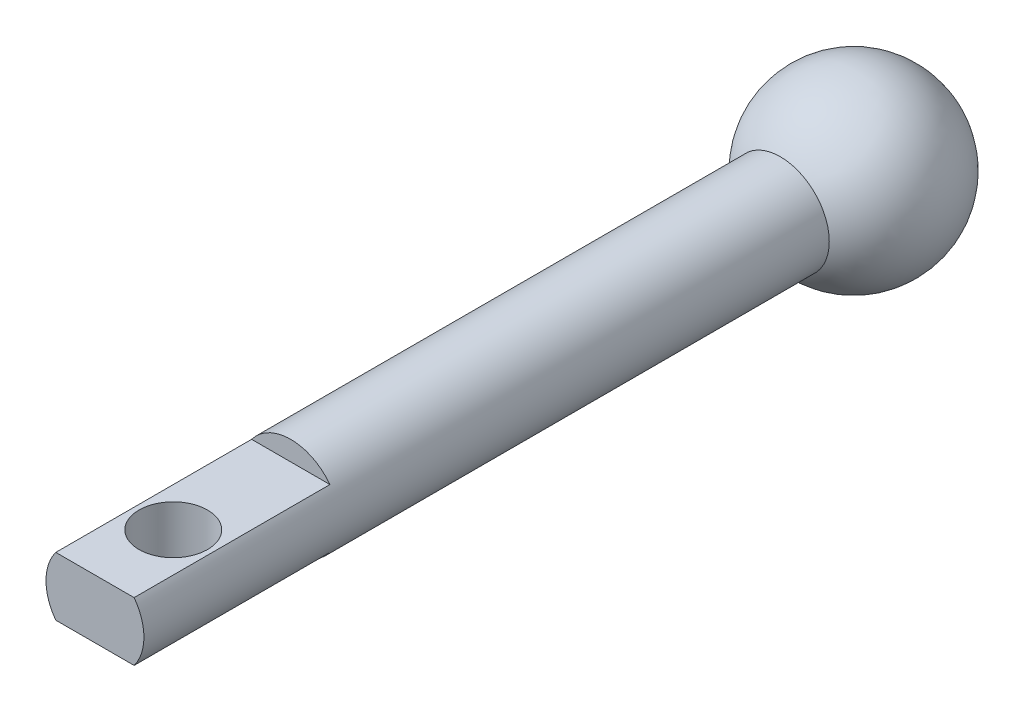
ISO-10303-21;
HEADER;
FILE_DESCRIPTION(('STEP AP214'),'2;1');
FILE_NAME('part.step','',(''),(''),'','','');
FILE_SCHEMA(('AUTOMOTIVE_DESIGN { 1 0 10303 214 1 1 1 1 }'));
ENDSEC;
DATA;
#1=APPLICATION_CONTEXT('core data for automotive mechanical design processes');
#2=APPLICATION_PROTOCOL_DEFINITION('international standard','automotive_design',2000,#1);
#3=PRODUCT_CONTEXT('',#1,'mechanical');
#4=PRODUCT('Part','Part','',(#3));
#5=PRODUCT_RELATED_PRODUCT_CATEGORY('part','',(#4));
#6=PRODUCT_DEFINITION_FORMATION('','',#4);
#7=PRODUCT_DEFINITION_CONTEXT('part definition',#1,'design');
#8=PRODUCT_DEFINITION('design','',#6,#7);
#9=PRODUCT_DEFINITION_SHAPE('','',#8);
#10=(LENGTH_UNIT() NAMED_UNIT(*) SI_UNIT(.MILLI.,.METRE.));
#11=(NAMED_UNIT(*) PLANE_ANGLE_UNIT() SI_UNIT($,.RADIAN.));
#12=(NAMED_UNIT(*) SI_UNIT($,.STERADIAN.) SOLID_ANGLE_UNIT());
#13=UNCERTAINTY_MEASURE_WITH_UNIT(LENGTH_MEASURE(1.E-05),#10,'distance_accuracy_value','');
#14=(GEOMETRIC_REPRESENTATION_CONTEXT(3) GLOBAL_UNCERTAINTY_ASSIGNED_CONTEXT((#13)) GLOBAL_UNIT_ASSIGNED_CONTEXT((#10,
#11,#12)) REPRESENTATION_CONTEXT('',''));
#15=CARTESIAN_POINT('',(0.,0.,0.));
#16=DIRECTION('',(0.,0.,1.));
#17=DIRECTION('',(1.,0.,0.));
#18=AXIS2_PLACEMENT_3D('',#15,#16,#17);
#19=CARTESIAN_POINT('',(0.,0.,0.));
#20=DIRECTION('',(0.,0.,-1.));
#21=DIRECTION('',(-1.,0.,0.));
#22=AXIS2_PLACEMENT_3D('',#19,#20,#21);
#23=PLANE('',#22);
#24=CARTESIAN_POINT('',(0.,0.,0.));
#25=DIRECTION('',(0.,0.,-1.));
#26=DIRECTION('',(-1.,0.,0.));
#27=AXIS2_PLACEMENT_3D('',#24,#25,#26);
#28=CIRCLE('',#27,2.50000000000001);
#29=CARTESIAN_POINT('',(2.,1.50000000000001,0.));
#30=VERTEX_POINT('',#29);
#31=CARTESIAN_POINT('',(2.,-1.50000000000001,0.));
#32=VERTEX_POINT('',#31);
#33=EDGE_CURVE('E11',#30,#32,#28,.T.);
#34=ORIENTED_EDGE('',*,*,#33,.F.);
#35=DIRECTION('',(1.,0.,0.));
#36=VECTOR('',#35,1.);
#37=CARTESIAN_POINT('',(0.,1.50000000000001,0.));
#38=LINE('',#37,#36);
#39=CARTESIAN_POINT('',(-2.,1.50000000000001,0.));
#40=VERTEX_POINT('',#39);
#41=EDGE_CURVE('E83',#40,#30,#38,.T.);
#42=ORIENTED_EDGE('',*,*,#41,.F.);
#43=CARTESIAN_POINT('',(-2.,-1.50000000000001,0.));
#44=VERTEX_POINT('',#43);
#45=EDGE_CURVE('E48',#44,#40,#28,.T.);
#46=ORIENTED_EDGE('',*,*,#45,.F.);
#47=DIRECTION('',(1.,0.,0.));
#48=VECTOR('',#47,1.);
#49=CARTESIAN_POINT('',(0.,-1.50000000000001,0.));
#50=LINE('',#49,#48);
#51=EDGE_CURVE('E115',#44,#32,#50,.T.);
#52=ORIENTED_EDGE('',*,*,#51,.T.);
#53=EDGE_LOOP('',(#34,#42,#46,#52));
#54=FACE_BOUND('',#53,.T.);
#55=ADVANCED_FACE('F39',(#54),#23,.F.);
#56=CARTESIAN_POINT('',(0.,0.,-43.2416573867739));
#57=DIRECTION('',(0.,0.,-1.));
#58=DIRECTION('',(-1.,0.,0.));
#59=AXIS2_PLACEMENT_3D('',#56,#57,#58);
#60=CYLINDRICAL_SURFACE('',#59,2.5);
#61=ORIENTED_EDGE('',*,*,#45,.T.);
#62=DIRECTION('',(0.,0.,1.));
#63=VECTOR('',#62,1.);
#64=CARTESIAN_POINT('',(-2.,1.50000000000001,-10.));
#65=LINE('',#64,#63);
#66=CARTESIAN_POINT('',(-2.,1.50000000000001,-10.));
#67=VERTEX_POINT('',#66);
#68=EDGE_CURVE('E80',#67,#40,#65,.T.);
#69=ORIENTED_EDGE('',*,*,#68,.F.);
#70=CARTESIAN_POINT('',(0.,0.,-10.));
#71=DIRECTION('',(0.,0.,1.));
#72=DIRECTION('',(1.,0.,0.));
#73=AXIS2_PLACEMENT_3D('',#70,#71,#72);
#74=CIRCLE('',#73,2.50000000000001);
#75=CARTESIAN_POINT('',(2.,1.5,-10.));
#76=VERTEX_POINT('',#75);
#77=EDGE_CURVE('E96',#76,#67,#74,.T.);
#78=ORIENTED_EDGE('',*,*,#77,.F.);
#79=DIRECTION('',(0.,0.,1.));
#80=VECTOR('',#79,1.);
#81=CARTESIAN_POINT('',(2.,1.50000000000001,-10.));
#82=LINE('',#81,#80);
#83=EDGE_CURVE('E89',#76,#30,#82,.T.);
#84=ORIENTED_EDGE('',*,*,#83,.T.);
#85=ORIENTED_EDGE('',*,*,#33,.T.);
#86=DIRECTION('',(0.,0.,1.));
#87=VECTOR('',#86,1.);
#88=CARTESIAN_POINT('',(2.,-1.50000000000001,-10.));
#89=LINE('',#88,#87);
#90=CARTESIAN_POINT('',(2.,-1.50000000000001,-10.));
#91=VERTEX_POINT('',#90);
#92=EDGE_CURVE('E97',#91,#32,#89,.T.);
#93=ORIENTED_EDGE('',*,*,#92,.F.);
#94=CARTESIAN_POINT('',(0.,0.,-10.));
#95=DIRECTION('',(0.,0.,1.));
#96=DIRECTION('',(1.,0.,0.));
#97=AXIS2_PLACEMENT_3D('',#94,#95,#96);
#98=CIRCLE('',#97,2.50000000000001);
#99=CARTESIAN_POINT('',(-2.,-1.50000000000001,-10.));
#100=VERTEX_POINT('',#99);
#101=EDGE_CURVE('E112',#100,#91,#98,.T.);
#102=ORIENTED_EDGE('',*,*,#101,.F.);
#103=DIRECTION('',(0.,0.,1.));
#104=VECTOR('',#103,1.);
#105=CARTESIAN_POINT('',(-2.,-1.50000000000001,-10.));
#106=LINE('',#105,#104);
#107=EDGE_CURVE('E103',#100,#44,#106,.T.);
#108=ORIENTED_EDGE('',*,*,#107,.T.);
#109=EDGE_LOOP('',(#61,#69,#78,#84,#85,#93,#102,#108));
#110=FACE_BOUND('',#109,.T.);
#111=CARTESIAN_POINT('',(0.,0.,-35.));
#112=DIRECTION('',(0.,0.,-1.));
#113=DIRECTION('',(-1.,0.,0.));
#114=AXIS2_PLACEMENT_3D('',#111,#112,#113);
#115=CIRCLE('',#114,2.5);
#116=CARTESIAN_POINT('',(-2.5,0.,-35.));
#117=VERTEX_POINT('',#116);
#118=EDGE_CURVE('E105',#117,#117,#115,.T.);
#119=ORIENTED_EDGE('',*,*,#118,.F.);
#120=EDGE_LOOP('',(#119));
#121=FACE_BOUND('',#120,.T.);
#122=ADVANCED_FACE('F100',(#110,#121),#60,.T.);
#123=CARTESIAN_POINT('',(0.,0.,-38.7416573867739));
#124=DIRECTION('',(0.,0.,-1.));
#125=DIRECTION('',(1.,0.,0.));
#126=AXIS2_PLACEMENT_3D('',#123,#124,#125);
#127=SPHERICAL_SURFACE('',#126,4.5);
#128=ORIENTED_EDGE('',*,*,#118,.T.);
#129=EDGE_LOOP('',(#128));
#130=FACE_BOUND('',#129,.T.);
#131=ADVANCED_FACE('F150',(#130),#127,.T.);
#132=CARTESIAN_POINT('',(0.,-1.50000000000001,-10.));
#133=DIRECTION('',(0.,-1.,0.));
#134=DIRECTION('',(0.,0.,-1.));
#135=AXIS2_PLACEMENT_3D('',#132,#133,#134);
#136=PLANE('',#135);
#137=CARTESIAN_POINT('',(0.,-1.50000000000001,-4.));
#138=DIRECTION('',(0.,-1.,0.));
#139=DIRECTION('',(0.,0.,-1.));
#140=AXIS2_PLACEMENT_3D('',#137,#138,#139);
#141=CIRCLE('',#140,1.75);
#142=CARTESIAN_POINT('',(0.,-1.50000000000001,-5.75));
#143=VERTEX_POINT('',#142);
#144=EDGE_CURVE('E118',#143,#143,#141,.T.);
#145=ORIENTED_EDGE('',*,*,#144,.F.);
#146=EDGE_LOOP('',(#145));
#147=FACE_BOUND('',#146,.T.);
#148=ORIENTED_EDGE('',*,*,#51,.F.);
#149=ORIENTED_EDGE('',*,*,#107,.F.);
#150=DIRECTION('',(1.,0.,0.));
#151=VECTOR('',#150,1.);
#152=CARTESIAN_POINT('',(0.,-1.50000000000001,-10.));
#153=LINE('',#152,#151);
#154=EDGE_CURVE('E61',#100,#91,#153,.T.);
#155=ORIENTED_EDGE('',*,*,#154,.T.);
#156=ORIENTED_EDGE('',*,*,#92,.T.);
#157=EDGE_LOOP('',(#148,#149,#155,#156));
#158=FACE_BOUND('',#157,.T.);
#159=ADVANCED_FACE('F154',(#147,#158),#136,.T.);
#160=CARTESIAN_POINT('',(0.,0.,-10.));
#161=DIRECTION('',(0.,0.,1.));
#162=DIRECTION('',(1.,0.,0.));
#163=AXIS2_PLACEMENT_3D('',#160,#161,#162);
#164=PLANE('',#163);
#165=ORIENTED_EDGE('',*,*,#154,.F.);
#166=ORIENTED_EDGE('',*,*,#101,.T.);
#167=EDGE_LOOP('',(#165,#166));
#168=FACE_BOUND('',#167,.T.);
#169=ADVANCED_FACE('F160',(#168),#164,.T.);
#170=CARTESIAN_POINT('',(0.,1.50000000000001,-10.));
#171=DIRECTION('',(0.,-1.,0.));
#172=DIRECTION('',(0.,0.,-1.));
#173=AXIS2_PLACEMENT_3D('',#170,#171,#172);
#174=PLANE('',#173);
#175=CARTESIAN_POINT('',(0.,1.50000000000001,-4.));
#176=DIRECTION('',(0.,-1.,0.));
#177=DIRECTION('',(0.,0.,-1.));
#178=AXIS2_PLACEMENT_3D('',#175,#176,#177);
#179=CIRCLE('',#178,1.75);
#180=CARTESIAN_POINT('',(0.,1.50000000000001,-5.75));
#181=VERTEX_POINT('',#180);
#182=EDGE_CURVE('E42',#181,#181,#179,.T.);
#183=ORIENTED_EDGE('',*,*,#182,.T.);
#184=EDGE_LOOP('',(#183));
#185=FACE_BOUND('',#184,.T.);
#186=ORIENTED_EDGE('',*,*,#41,.T.);
#187=ORIENTED_EDGE('',*,*,#83,.F.);
#188=DIRECTION('',(1.,0.,0.));
#189=VECTOR('',#188,1.);
#190=CARTESIAN_POINT('',(0.,1.50000000000001,-10.));
#191=LINE('',#190,#189);
#192=EDGE_CURVE('E54',#67,#76,#191,.T.);
#193=ORIENTED_EDGE('',*,*,#192,.F.);
#194=ORIENTED_EDGE('',*,*,#68,.T.);
#195=EDGE_LOOP('',(#186,#187,#193,#194));
#196=FACE_BOUND('',#195,.T.);
#197=ADVANCED_FACE('F82',(#185,#196),#174,.F.);
#198=CARTESIAN_POINT('',(0.,0.,-10.));
#199=DIRECTION('',(0.,0.,1.));
#200=DIRECTION('',(1.,0.,0.));
#201=AXIS2_PLACEMENT_3D('',#198,#199,#200);
#202=PLANE('',#201);
#203=ORIENTED_EDGE('',*,*,#77,.T.);
#204=ORIENTED_EDGE('',*,*,#192,.T.);
#205=EDGE_LOOP('',(#203,#204));
#206=FACE_BOUND('',#205,.T.);
#207=ADVANCED_FACE('F140',(#206),#202,.T.);
#208=CARTESIAN_POINT('',(0.,-4.5,-4.));
#209=DIRECTION('',(0.,1.,0.));
#210=DIRECTION('',(0.,0.,1.));
#211=AXIS2_PLACEMENT_3D('',#208,#209,#210);
#212=CYLINDRICAL_SURFACE('',#211,1.75);
#213=ORIENTED_EDGE('',*,*,#144,.T.);
#214=EDGE_LOOP('',(#213));
#215=FACE_BOUND('',#214,.T.);
#216=ORIENTED_EDGE('',*,*,#182,.F.);
#217=EDGE_LOOP('',(#216));
#218=FACE_BOUND('',#217,.T.);
#219=ADVANCED_FACE('F138',(#215,#218),#212,.F.);
#220=CLOSED_SHELL('',(#55,#122,#131,#159,#169,#197,#207,#219));
#221=MANIFOLD_SOLID_BREP('B2',#220);
#222=ADVANCED_BREP_SHAPE_REPRESENTATION('',(#18,#221),#14);
#223=SHAPE_DEFINITION_REPRESENTATION(#9,#222);
ENDSEC;
END-ISO-10303-21;
